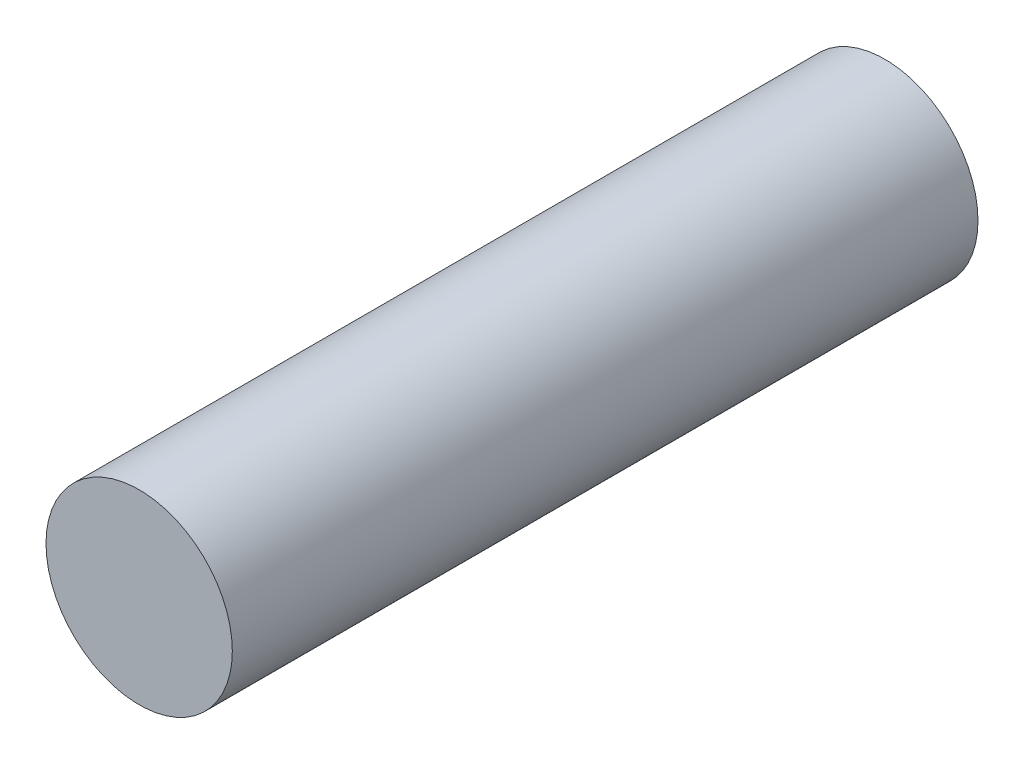
ISO-10303-21;
HEADER;
FILE_DESCRIPTION(('STEP AP214'),'2;1');
FILE_NAME('part.step','',(''),(''),'','','');
FILE_SCHEMA(('AUTOMOTIVE_DESIGN { 1 0 10303 214 1 1 1 1 }'));
ENDSEC;
DATA;
#1=APPLICATION_CONTEXT('core data for automotive mechanical design processes');
#2=APPLICATION_PROTOCOL_DEFINITION('international standard','automotive_design',2000,#1);
#3=PRODUCT_CONTEXT('',#1,'mechanical');
#4=PRODUCT('Part','Part','',(#3));
#5=PRODUCT_RELATED_PRODUCT_CATEGORY('part','',(#4));
#6=PRODUCT_DEFINITION_FORMATION('','',#4);
#7=PRODUCT_DEFINITION_CONTEXT('part definition',#1,'design');
#8=PRODUCT_DEFINITION('design','',#6,#7);
#9=PRODUCT_DEFINITION_SHAPE('','',#8);
#10=(LENGTH_UNIT() NAMED_UNIT(*) SI_UNIT(.MILLI.,.METRE.));
#11=(NAMED_UNIT(*) PLANE_ANGLE_UNIT() SI_UNIT($,.RADIAN.));
#12=(NAMED_UNIT(*) SI_UNIT($,.STERADIAN.) SOLID_ANGLE_UNIT());
#13=UNCERTAINTY_MEASURE_WITH_UNIT(LENGTH_MEASURE(1.E-05),#10,'distance_accuracy_value','');
#14=(GEOMETRIC_REPRESENTATION_CONTEXT(3) GLOBAL_UNCERTAINTY_ASSIGNED_CONTEXT((#13)) GLOBAL_UNIT_ASSIGNED_CONTEXT((#10,
#11,#12)) REPRESENTATION_CONTEXT('',''));
#15=CARTESIAN_POINT('',(0.,0.,0.));
#16=DIRECTION('',(0.,0.,1.));
#17=DIRECTION('',(1.,0.,0.));
#18=AXIS2_PLACEMENT_3D('',#15,#16,#17);
#19=CARTESIAN_POINT('',(0.,0.,38.1));
#20=DIRECTION('',(0.,0.,-1.));
#21=DIRECTION('',(-1.,0.,0.));
#22=AXIS2_PLACEMENT_3D('',#19,#20,#21);
#23=CYLINDRICAL_SURFACE('',#22,4.76);
#24=CARTESIAN_POINT('',(0.,0.,38.1));
#25=DIRECTION('',(0.,0.,1.));
#26=DIRECTION('',(1.,0.,0.));
#27=AXIS2_PLACEMENT_3D('',#24,#25,#26);
#28=CIRCLE('',#27,4.76);
#29=CARTESIAN_POINT('',(-4.76,0.,38.1));
#30=VERTEX_POINT('',#29);
#31=EDGE_CURVE('E10',#30,#30,#28,.T.);
#32=CARTESIAN_POINT('',(0.,0.,0.));
#33=DIRECTION('',(0.,0.,1.));
#34=DIRECTION('',(1.,0.,0.));
#35=AXIS2_PLACEMENT_3D('',#32,#33,#34);
#36=CIRCLE('',#35,4.76);
#37=CARTESIAN_POINT('',(-4.76,0.,0.));
#38=VERTEX_POINT('',#37);
#39=EDGE_CURVE('E40',#38,#38,#36,.T.);
#40=CARTESIAN_POINT('',(-4.76,0.,38.1));
#41=CARTESIAN_POINT('',(-4.76,0.,37.703125));
#42=CARTESIAN_POINT('',(-4.76,0.,37.30625));
#43=CARTESIAN_POINT('',(-4.76,0.,36.5125));
#44=CARTESIAN_POINT('',(-4.76,0.,36.115625));
#45=CARTESIAN_POINT('',(-4.76,0.,35.321875));
#46=CARTESIAN_POINT('',(-4.76,0.,34.925));
#47=CARTESIAN_POINT('',(-4.76,0.,34.13125));
#48=CARTESIAN_POINT('',(-4.76,0.,33.734375));
#49=CARTESIAN_POINT('',(-4.76,0.,32.940625));
#50=CARTESIAN_POINT('',(-4.76,0.,32.54375));
#51=CARTESIAN_POINT('',(-4.76,0.,31.75));
#52=CARTESIAN_POINT('',(-4.76,0.,31.353125));
#53=CARTESIAN_POINT('',(-4.76,0.,30.559375));
#54=CARTESIAN_POINT('',(-4.76,0.,30.1625));
#55=CARTESIAN_POINT('',(-4.76,0.,29.36875));
#56=CARTESIAN_POINT('',(-4.76,0.,28.971875));
#57=CARTESIAN_POINT('',(-4.76,0.,28.178125));
#58=CARTESIAN_POINT('',(-4.76,0.,27.78125));
#59=CARTESIAN_POINT('',(-4.76,0.,26.9875));
#60=CARTESIAN_POINT('',(-4.76,0.,26.590625));
#61=CARTESIAN_POINT('',(-4.76,0.,25.796875));
#62=CARTESIAN_POINT('',(-4.76,0.,25.4));
#63=CARTESIAN_POINT('',(-4.76,0.,24.60625));
#64=CARTESIAN_POINT('',(-4.76,0.,24.209375));
#65=CARTESIAN_POINT('',(-4.76,0.,23.415625));
#66=CARTESIAN_POINT('',(-4.76,0.,23.01875));
#67=CARTESIAN_POINT('',(-4.76,0.,22.225));
#68=CARTESIAN_POINT('',(-4.76,0.,21.828125));
#69=CARTESIAN_POINT('',(-4.76,0.,21.034375));
#70=CARTESIAN_POINT('',(-4.76,0.,20.6375));
#71=CARTESIAN_POINT('',(-4.76,0.,19.84375));
#72=CARTESIAN_POINT('',(-4.76,0.,19.446875));
#73=CARTESIAN_POINT('',(-4.76,0.,18.653125));
#74=CARTESIAN_POINT('',(-4.76,0.,18.25625));
#75=CARTESIAN_POINT('',(-4.76,0.,17.4625));
#76=CARTESIAN_POINT('',(-4.76,0.,17.065625));
#77=CARTESIAN_POINT('',(-4.76,0.,16.271875));
#78=CARTESIAN_POINT('',(-4.76,0.,15.875));
#79=CARTESIAN_POINT('',(-4.76,0.,15.08125));
#80=CARTESIAN_POINT('',(-4.76,0.,14.684375));
#81=CARTESIAN_POINT('',(-4.76,0.,13.890625));
#82=CARTESIAN_POINT('',(-4.76,0.,13.49375));
#83=CARTESIAN_POINT('',(-4.76,0.,12.7));
#84=CARTESIAN_POINT('',(-4.76,0.,12.303125));
#85=CARTESIAN_POINT('',(-4.76,0.,11.509375));
#86=CARTESIAN_POINT('',(-4.76,0.,11.1125));
#87=CARTESIAN_POINT('',(-4.76,0.,10.31875));
#88=CARTESIAN_POINT('',(-4.76,0.,9.92187499999999));
#89=CARTESIAN_POINT('',(-4.76,0.,9.128125));
#90=CARTESIAN_POINT('',(-4.76,0.,8.73124999999999));
#91=CARTESIAN_POINT('',(-4.76,0.,7.93749999999999));
#92=CARTESIAN_POINT('',(-4.76,0.,7.54062499999999));
#93=CARTESIAN_POINT('',(-4.76,0.,6.746875));
#94=CARTESIAN_POINT('',(-4.76,0.,6.35));
#95=CARTESIAN_POINT('',(-4.76,0.,5.55625));
#96=CARTESIAN_POINT('',(-4.76,0.,5.159375));
#97=CARTESIAN_POINT('',(-4.76,0.,4.365625));
#98=CARTESIAN_POINT('',(-4.76,0.,3.96875));
#99=CARTESIAN_POINT('',(-4.76,0.,3.175));
#100=CARTESIAN_POINT('',(-4.76,0.,2.778125));
#101=CARTESIAN_POINT('',(-4.76,0.,1.984375));
#102=CARTESIAN_POINT('',(-4.76,0.,1.5875));
#103=CARTESIAN_POINT('',(-4.76,0.,0.79375));
#104=CARTESIAN_POINT('',(-4.76,0.,0.396875));
#105=CARTESIAN_POINT('',(-4.76,0.,0.));
#106=B_SPLINE_CURVE_WITH_KNOTS('',3,(#40,#41,#42,#43,#44,#45,#46,#47,#48,#49,#50,#51,#52,#53,
#54,#55,#56,#57,#58,#59,#60,#61,#62,#63,#64,#65,#66,#67,#68,#69,#70,#71,#72,#73,#74,#75,#76,#77,
#78,#79,#80,#81,#82,#83,#84,#85,#86,#87,#88,#89,#90,#91,#92,#93,#94,#95,#96,#97,#98,#99,#100,
#101,#102,#103,#104,#105),.UNSPECIFIED.,.F.,.F.,(4,2,2,2,2,2,2,2,2,2,2,2,2,2,2,2,2,2,2,2,2,2,2,
2,2,2,2,2,2,2,2,2,4),(0.,1.190625,2.38125,3.571875,4.7625,5.953125,7.14375,8.334375,
9.52500000000001,10.715625,11.90625,13.096875,14.2875,15.478125,16.66875,17.859375,19.05,
20.240625,21.43125,22.621875,23.8125,25.003125,26.19375,27.384375,28.575,29.765625,30.95625,
32.146875,33.3375,34.528125,35.71875,36.909375,38.1),.UNSPECIFIED.);
#107=EDGE_CURVE('BSEAM37',#30,#38,#106,.T.);
#108=ORIENTED_EDGE('',*,*,#31,.F.);
#109=ORIENTED_EDGE('',*,*,#39,.T.);
#110=ORIENTED_EDGE('',*,*,#107,.T.);
#111=ORIENTED_EDGE('',*,*,#107,.F.);
#112=EDGE_LOOP('',(#108,#110,#109,#111));
#113=FACE_BOUND('',#112,.T.);
#114=ADVANCED_FACE('F37',(#113),#23,.T.);
#115=CARTESIAN_POINT('',(0.,0.,38.1));
#116=DIRECTION('',(0.,0.,1.));
#117=DIRECTION('',(1.,0.,0.));
#118=AXIS2_PLACEMENT_3D('',#115,#116,#117);
#119=PLANE('',#118);
#120=ORIENTED_EDGE('',*,*,#31,.T.);
#121=EDGE_LOOP('',(#120));
#122=FACE_BOUND('',#121,.T.);
#123=ADVANCED_FACE('F54',(#122),#119,.T.);
#124=CARTESIAN_POINT('',(0.,0.,0.));
#125=DIRECTION('',(0.,0.,1.));
#126=DIRECTION('',(1.,0.,0.));
#127=AXIS2_PLACEMENT_3D('',#124,#125,#126);
#128=PLANE('',#127);
#129=ORIENTED_EDGE('',*,*,#39,.F.);
#130=EDGE_LOOP('',(#129));
#131=FACE_BOUND('',#130,.T.);
#132=ADVANCED_FACE('F52',(#131),#128,.F.);
#133=CLOSED_SHELL('',(#114,#123,#132));
#134=MANIFOLD_SOLID_BREP('B2',#133);
#135=ADVANCED_BREP_SHAPE_REPRESENTATION('',(#18,#134),#14);
#136=SHAPE_DEFINITION_REPRESENTATION(#9,#135);
ENDSEC;
END-ISO-10303-21;
